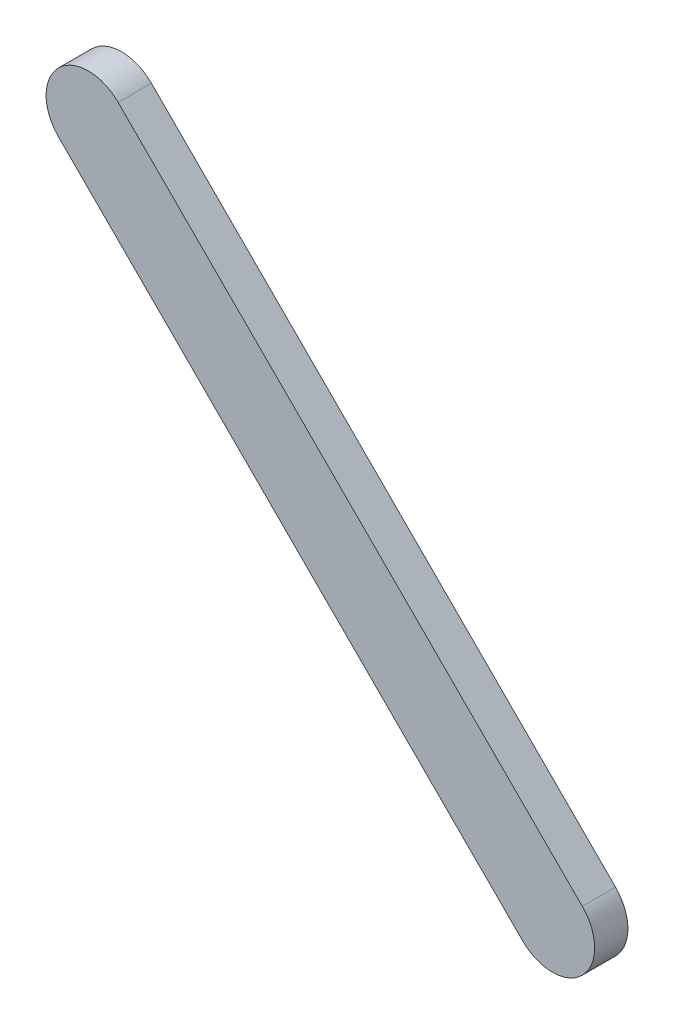
ISO-10303-21;
HEADER;
FILE_DESCRIPTION(('STEP AP214'),'2;1');
FILE_NAME('part.step','',(''),(''),'','','');
FILE_SCHEMA(('AUTOMOTIVE_DESIGN { 1 0 10303 214 1 1 1 1 }'));
ENDSEC;
DATA;
#1=APPLICATION_CONTEXT('core data for automotive mechanical design processes');
#2=APPLICATION_PROTOCOL_DEFINITION('international standard','automotive_design',2000,#1);
#3=PRODUCT_CONTEXT('',#1,'mechanical');
#4=PRODUCT('Part','Part','',(#3));
#5=PRODUCT_RELATED_PRODUCT_CATEGORY('part','',(#4));
#6=PRODUCT_DEFINITION_FORMATION('','',#4);
#7=PRODUCT_DEFINITION_CONTEXT('part definition',#1,'design');
#8=PRODUCT_DEFINITION('design','',#6,#7);
#9=PRODUCT_DEFINITION_SHAPE('','',#8);
#10=(LENGTH_UNIT() NAMED_UNIT(*) SI_UNIT(.MILLI.,.METRE.));
#11=(NAMED_UNIT(*) PLANE_ANGLE_UNIT() SI_UNIT($,.RADIAN.));
#12=(NAMED_UNIT(*) SI_UNIT($,.STERADIAN.) SOLID_ANGLE_UNIT());
#13=UNCERTAINTY_MEASURE_WITH_UNIT(LENGTH_MEASURE(1.E-05),#10,'distance_accuracy_value','');
#14=(GEOMETRIC_REPRESENTATION_CONTEXT(3) GLOBAL_UNCERTAINTY_ASSIGNED_CONTEXT((#13)) GLOBAL_UNIT_ASSIGNED_CONTEXT((#10,
#11,#12)) REPRESENTATION_CONTEXT('',''));
#15=CARTESIAN_POINT('',(0.,0.,0.));
#16=DIRECTION('',(0.,0.,1.));
#17=DIRECTION('',(1.,0.,0.));
#18=AXIS2_PLACEMENT_3D('',#15,#16,#17);
#19=CARTESIAN_POINT('',(115.3395966,118.03199406,0.));
#20=DIRECTION('',(0.707106781186549,0.707106781186546,0.));
#21=DIRECTION('',(0.707106781186546,-0.707106781186549,0.));
#22=AXIS2_PLACEMENT_3D('',#19,#20,#21);
#23=PLANE('',#22);
#24=DIRECTION('',(0.707106781186546,-0.707106781186549,0.));
#25=VECTOR('',#24,1.);
#26=CARTESIAN_POINT('',(115.3395966,118.03199406,0.1999996));
#27=LINE('',#26,#25);
#28=CARTESIAN_POINT('',(115.3395966,118.03199406,0.1999996));
#29=VERTEX_POINT('',#28);
#30=CARTESIAN_POINT('',(118.13359406,115.2379966,0.1999996));
#31=VERTEX_POINT('',#30);
#32=EDGE_CURVE('E11',#29,#31,#27,.T.);
#33=ORIENTED_EDGE('',*,*,#32,.F.);
#34=DIRECTION('',(0.,0.,1.));
#35=VECTOR('',#34,1.);
#36=CARTESIAN_POINT('',(115.3395966,118.03199406,0.));
#37=LINE('',#36,#35);
#38=CARTESIAN_POINT('',(115.3395966,118.03199406,0.));
#39=VERTEX_POINT('',#38);
#40=EDGE_CURVE('E24',#39,#29,#37,.T.);
#41=ORIENTED_EDGE('',*,*,#40,.F.);
#42=DIRECTION('',(0.707106781186546,-0.707106781186549,0.));
#43=VECTOR('',#42,1.);
#44=CARTESIAN_POINT('',(115.3395966,118.03199406,0.));
#45=LINE('',#44,#43);
#46=CARTESIAN_POINT('',(118.13359406,115.2379966,0.));
#47=VERTEX_POINT('',#46);
#48=EDGE_CURVE('E75',#39,#47,#45,.T.);
#49=ORIENTED_EDGE('',*,*,#48,.T.);
#50=DIRECTION('',(0.,0.,1.));
#51=VECTOR('',#50,1.);
#52=CARTESIAN_POINT('',(118.13359406,115.2379966,0.));
#53=LINE('',#52,#51);
#54=EDGE_CURVE('E37',#47,#31,#53,.T.);
#55=ORIENTED_EDGE('',*,*,#54,.T.);
#56=EDGE_LOOP('',(#33,#41,#49,#55));
#57=FACE_BOUND('',#56,.T.);
#58=ADVANCED_FACE('F17',(#57),#23,.F.);
#59=CARTESIAN_POINT('',(118.31319873,115.41760127,0.));
#60=DIRECTION('',(0.,0.,-1.));
#61=DIRECTION('',(-0.707106781186548,-0.707106781186548,0.));
#62=AXIS2_PLACEMENT_3D('',#59,#60,#61);
#63=CYLINDRICAL_SURFACE('',#62,0.253999360179552);
#64=CARTESIAN_POINT('',(118.31319873,115.41760127,0.1999996));
#65=DIRECTION('',(0.,0.,1.));
#66=DIRECTION('',(-0.707106781186548,-0.707106781186548,0.));
#67=AXIS2_PLACEMENT_3D('',#64,#65,#66);
#68=CIRCLE('',#67,0.253999360179552);
#69=CARTESIAN_POINT('',(118.4928034,115.59720594,0.1999996));
#70=VERTEX_POINT('',#69);
#71=EDGE_CURVE('E83',#31,#70,#68,.T.);
#72=ORIENTED_EDGE('',*,*,#71,.F.);
#73=ORIENTED_EDGE('',*,*,#54,.F.);
#74=CARTESIAN_POINT('',(118.31319873,115.41760127,0.));
#75=DIRECTION('',(0.,0.,1.));
#76=DIRECTION('',(-0.707106781186548,-0.707106781186548,0.));
#77=AXIS2_PLACEMENT_3D('',#74,#75,#76);
#78=CIRCLE('',#77,0.253999360179552);
#79=CARTESIAN_POINT('',(118.4928034,115.59720594,0.));
#80=VERTEX_POINT('',#79);
#81=EDGE_CURVE('E81',#47,#80,#78,.T.);
#82=ORIENTED_EDGE('',*,*,#81,.T.);
#83=DIRECTION('',(0.,0.,1.));
#84=VECTOR('',#83,1.);
#85=CARTESIAN_POINT('',(118.4928034,115.59720594,0.));
#86=LINE('',#85,#84);
#87=EDGE_CURVE('E67',#80,#70,#86,.T.);
#88=ORIENTED_EDGE('',*,*,#87,.T.);
#89=EDGE_LOOP('',(#72,#73,#82,#88));
#90=FACE_BOUND('',#89,.T.);
#91=ADVANCED_FACE('F89',(#90),#63,.T.);
#92=CARTESIAN_POINT('',(118.4928034,115.59720594,0.));
#93=DIRECTION('',(-0.707106781186546,-0.707106781186549,0.));
#94=DIRECTION('',(-0.707106781186549,0.707106781186546,0.));
#95=AXIS2_PLACEMENT_3D('',#92,#93,#94);
#96=PLANE('',#95);
#97=DIRECTION('',(-0.707106781186549,0.707106781186546,0.));
#98=VECTOR('',#97,1.);
#99=CARTESIAN_POINT('',(118.4928034,115.59720594,0.1999996));
#100=LINE('',#99,#98);
#101=CARTESIAN_POINT('',(115.69880594,118.3912034,0.1999996));
#102=VERTEX_POINT('',#101);
#103=EDGE_CURVE('E71',#70,#102,#100,.T.);
#104=ORIENTED_EDGE('',*,*,#103,.F.);
#105=ORIENTED_EDGE('',*,*,#87,.F.);
#106=DIRECTION('',(-0.707106781186549,0.707106781186546,0.));
#107=VECTOR('',#106,1.);
#108=CARTESIAN_POINT('',(118.4928034,115.59720594,0.));
#109=LINE('',#108,#107);
#110=CARTESIAN_POINT('',(115.69880594,118.3912034,0.));
#111=VERTEX_POINT('',#110);
#112=EDGE_CURVE('E63',#80,#111,#109,.T.);
#113=ORIENTED_EDGE('',*,*,#112,.T.);
#114=DIRECTION('',(0.,0.,1.));
#115=VECTOR('',#114,1.);
#116=CARTESIAN_POINT('',(115.69880594,118.3912034,0.));
#117=LINE('',#116,#115);
#118=EDGE_CURVE('E53',#111,#102,#117,.T.);
#119=ORIENTED_EDGE('',*,*,#118,.T.);
#120=EDGE_LOOP('',(#104,#105,#113,#119));
#121=FACE_BOUND('',#120,.T.);
#122=ADVANCED_FACE('F66',(#121),#96,.F.);
#123=CARTESIAN_POINT('',(115.51920127,118.21159873,0.));
#124=DIRECTION('',(0.,0.,-1.));
#125=DIRECTION('',(0.70710678118652,0.707106781186576,0.));
#126=AXIS2_PLACEMENT_3D('',#123,#124,#125);
#127=CYLINDRICAL_SURFACE('',#126,0.253999360179539);
#128=CARTESIAN_POINT('',(115.51920127,118.21159873,0.1999996));
#129=DIRECTION('',(0.,0.,1.));
#130=DIRECTION('',(0.70710678118652,0.707106781186576,0.));
#131=AXIS2_PLACEMENT_3D('',#128,#129,#130);
#132=CIRCLE('',#131,0.253999360179539);
#133=EDGE_CURVE('E59',#102,#29,#132,.T.);
#134=ORIENTED_EDGE('',*,*,#133,.F.);
#135=ORIENTED_EDGE('',*,*,#118,.F.);
#136=CARTESIAN_POINT('',(115.51920127,118.21159873,0.));
#137=DIRECTION('',(0.,0.,1.));
#138=DIRECTION('',(0.70710678118652,0.707106781186576,0.));
#139=AXIS2_PLACEMENT_3D('',#136,#137,#138);
#140=CIRCLE('',#139,0.253999360179539);
#141=EDGE_CURVE('E57',#111,#39,#140,.T.);
#142=ORIENTED_EDGE('',*,*,#141,.T.);
#143=ORIENTED_EDGE('',*,*,#40,.T.);
#144=EDGE_LOOP('',(#134,#135,#142,#143));
#145=FACE_BOUND('',#144,.T.);
#146=ADVANCED_FACE('F55',(#145),#127,.T.);
#147=CARTESIAN_POINT('',(115.3395966,118.03199406,0.));
#148=DIRECTION('',(0.,0.,-1.));
#149=DIRECTION('',(-1.,0.,0.));
#150=AXIS2_PLACEMENT_3D('',#147,#148,#149);
#151=PLANE('',#150);
#152=ORIENTED_EDGE('',*,*,#141,.F.);
#153=ORIENTED_EDGE('',*,*,#112,.F.);
#154=ORIENTED_EDGE('',*,*,#81,.F.);
#155=ORIENTED_EDGE('',*,*,#48,.F.);
#156=EDGE_LOOP('',(#152,#153,#154,#155));
#157=FACE_BOUND('',#156,.T.);
#158=ADVANCED_FACE('F74',(#157),#151,.T.);
#159=CARTESIAN_POINT('',(115.3395966,118.03199406,0.1999996));
#160=DIRECTION('',(0.,0.,-1.));
#161=DIRECTION('',(-1.,0.,0.));
#162=AXIS2_PLACEMENT_3D('',#159,#160,#161);
#163=PLANE('',#162);
#164=ORIENTED_EDGE('',*,*,#32,.T.);
#165=ORIENTED_EDGE('',*,*,#71,.T.);
#166=ORIENTED_EDGE('',*,*,#103,.T.);
#167=ORIENTED_EDGE('',*,*,#133,.T.);
#168=EDGE_LOOP('',(#164,#165,#166,#167));
#169=FACE_BOUND('',#168,.T.);
#170=ADVANCED_FACE('F91',(#169),#163,.F.);
#171=CLOSED_SHELL('',(#58,#91,#122,#146,#158,#170));
#172=MANIFOLD_SOLID_BREP('B1',#171);
#173=ADVANCED_BREP_SHAPE_REPRESENTATION('',(#18,#172),#14);
#174=SHAPE_DEFINITION_REPRESENTATION(#9,#173);
ENDSEC;
END-ISO-10303-21;
